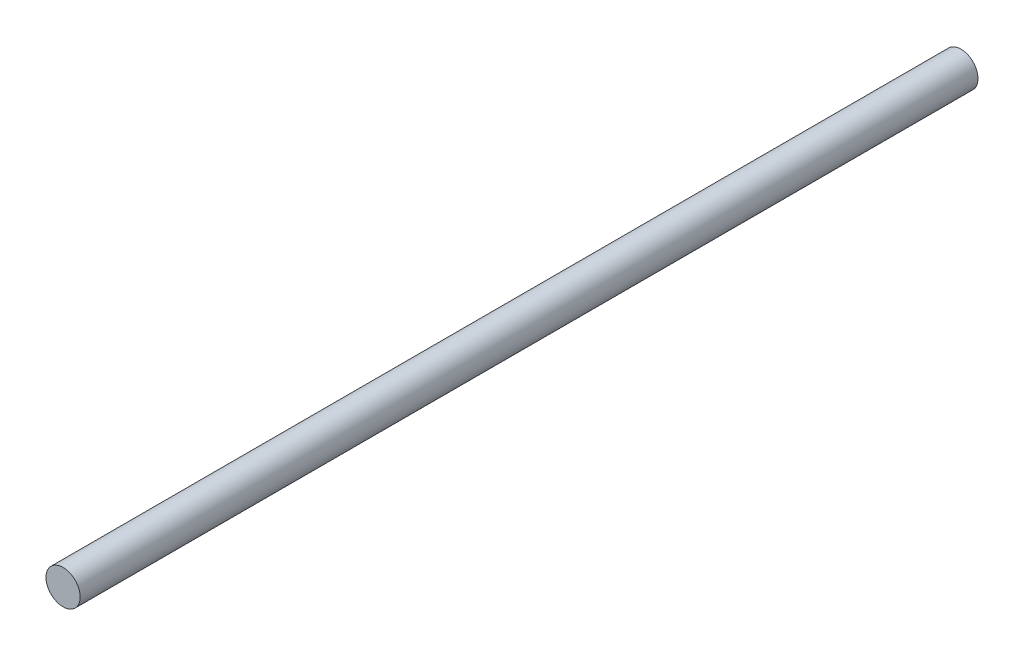
ISO-10303-21;
HEADER;
FILE_DESCRIPTION(('STEP AP214'),'2;1');
FILE_NAME('part.step','',(''),(''),'','','');
FILE_SCHEMA(('AUTOMOTIVE_DESIGN { 1 0 10303 214 1 1 1 1 }'));
ENDSEC;
DATA;
#1=APPLICATION_CONTEXT('core data for automotive mechanical design processes');
#2=APPLICATION_PROTOCOL_DEFINITION('international standard','automotive_design',2000,#1);
#3=PRODUCT_CONTEXT('',#1,'mechanical');
#4=PRODUCT('Part','Part','',(#3));
#5=PRODUCT_RELATED_PRODUCT_CATEGORY('part','',(#4));
#6=PRODUCT_DEFINITION_FORMATION('','',#4);
#7=PRODUCT_DEFINITION_CONTEXT('part definition',#1,'design');
#8=PRODUCT_DEFINITION('design','',#6,#7);
#9=PRODUCT_DEFINITION_SHAPE('','',#8);
#10=(LENGTH_UNIT() NAMED_UNIT(*) SI_UNIT(.MILLI.,.METRE.));
#11=(NAMED_UNIT(*) PLANE_ANGLE_UNIT() SI_UNIT($,.RADIAN.));
#12=(NAMED_UNIT(*) SI_UNIT($,.STERADIAN.) SOLID_ANGLE_UNIT());
#13=UNCERTAINTY_MEASURE_WITH_UNIT(LENGTH_MEASURE(1.E-05),#10,'distance_accuracy_value','');
#14=(GEOMETRIC_REPRESENTATION_CONTEXT(3) GLOBAL_UNCERTAINTY_ASSIGNED_CONTEXT((#13)) GLOBAL_UNIT_ASSIGNED_CONTEXT((#10,
#11,#12)) REPRESENTATION_CONTEXT('',''));
#15=CARTESIAN_POINT('',(0.,0.,0.));
#16=DIRECTION('',(0.,0.,1.));
#17=DIRECTION('',(1.,0.,0.));
#18=AXIS2_PLACEMENT_3D('',#15,#16,#17);
#19=CARTESIAN_POINT('',(0.,0.,210.));
#20=DIRECTION('',(0.,0.,-1.));
#21=DIRECTION('',(-1.,0.,0.));
#22=AXIS2_PLACEMENT_3D('',#19,#20,#21);
#23=CYLINDRICAL_SURFACE('',#22,4.);
#24=CARTESIAN_POINT('',(0.,0.,210.));
#25=DIRECTION('',(0.,0.,1.));
#26=DIRECTION('',(1.,0.,0.));
#27=AXIS2_PLACEMENT_3D('',#24,#25,#26);
#28=CIRCLE('',#27,4.);
#29=CARTESIAN_POINT('',(4.,0.,210.));
#30=VERTEX_POINT('',#29);
#31=EDGE_CURVE('E10',#30,#30,#28,.T.);
#32=ORIENTED_EDGE('',*,*,#31,.F.);
#33=EDGE_LOOP('',(#32));
#34=FACE_BOUND('',#33,.T.);
#35=CARTESIAN_POINT('',(0.,0.,0.));
#36=DIRECTION('',(0.,0.,1.));
#37=DIRECTION('',(1.,0.,0.));
#38=AXIS2_PLACEMENT_3D('',#35,#36,#37);
#39=CIRCLE('',#38,4.);
#40=CARTESIAN_POINT('',(4.,0.,0.));
#41=VERTEX_POINT('',#40);
#42=EDGE_CURVE('E39',#41,#41,#39,.T.);
#43=ORIENTED_EDGE('',*,*,#42,.T.);
#44=EDGE_LOOP('',(#43));
#45=FACE_BOUND('',#44,.T.);
#46=ADVANCED_FACE('F36',(#34,#45),#23,.T.);
#47=CARTESIAN_POINT('',(0.,0.,210.));
#48=DIRECTION('',(0.,0.,1.));
#49=DIRECTION('',(1.,0.,0.));
#50=AXIS2_PLACEMENT_3D('',#47,#48,#49);
#51=PLANE('',#50);
#52=ORIENTED_EDGE('',*,*,#31,.T.);
#53=EDGE_LOOP('',(#52));
#54=FACE_BOUND('',#53,.T.);
#55=ADVANCED_FACE('F51',(#54),#51,.T.);
#56=CARTESIAN_POINT('',(0.,0.,0.));
#57=DIRECTION('',(0.,0.,1.));
#58=DIRECTION('',(1.,0.,0.));
#59=AXIS2_PLACEMENT_3D('',#56,#57,#58);
#60=PLANE('',#59);
#61=ORIENTED_EDGE('',*,*,#42,.F.);
#62=EDGE_LOOP('',(#61));
#63=FACE_BOUND('',#62,.T.);
#64=ADVANCED_FACE('F49',(#63),#60,.F.);
#65=CLOSED_SHELL('',(#46,#55,#64));
#66=MANIFOLD_SOLID_BREP('B2',#65);
#67=ADVANCED_BREP_SHAPE_REPRESENTATION('',(#18,#66),#14);
#68=SHAPE_DEFINITION_REPRESENTATION(#9,#67);
ENDSEC;
END-ISO-10303-21;
